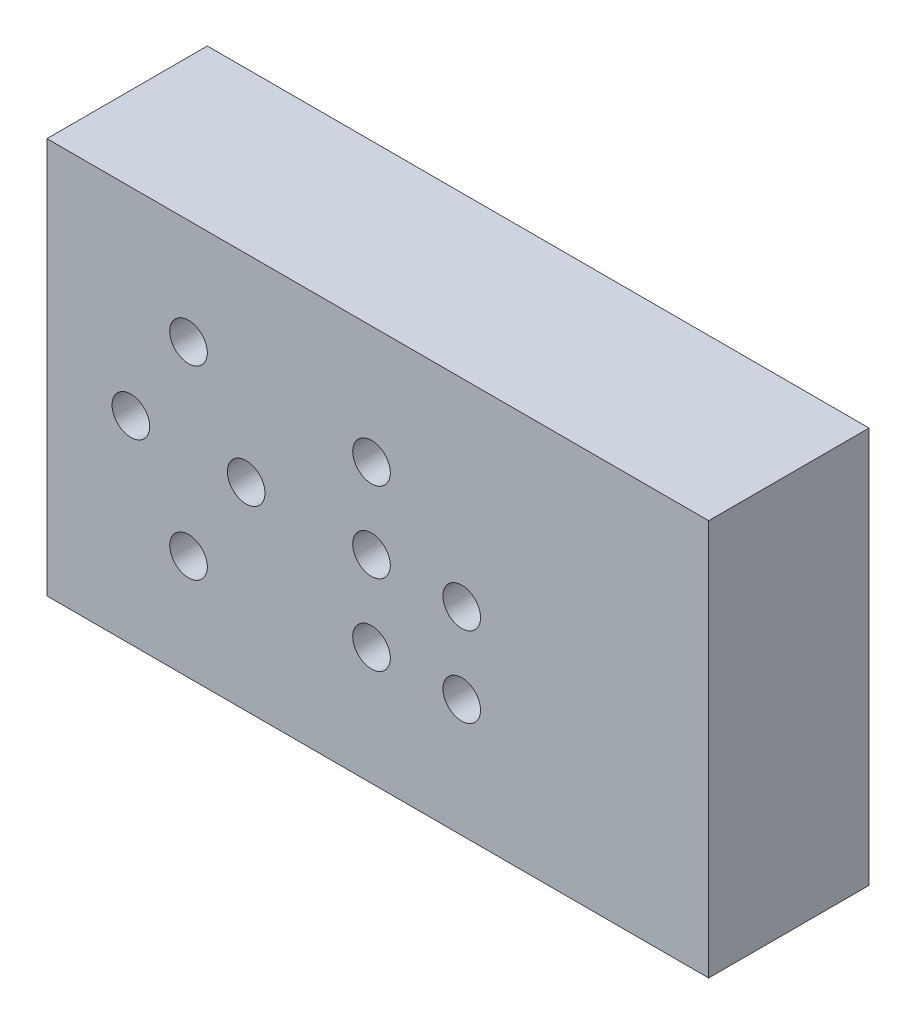
ISO-10303-21;
HEADER;
FILE_DESCRIPTION(('STEP AP214'),'2;1');
FILE_NAME('part.step','',(''),(''),'','','');
FILE_SCHEMA(('AUTOMOTIVE_DESIGN { 1 0 10303 214 1 1 1 1 }'));
ENDSEC;
DATA;
#1=APPLICATION_CONTEXT('core data for automotive mechanical design processes');
#2=APPLICATION_PROTOCOL_DEFINITION('international standard','automotive_design',2000,#1);
#3=PRODUCT_CONTEXT('',#1,'mechanical');
#4=PRODUCT('Part','Part','',(#3));
#5=PRODUCT_RELATED_PRODUCT_CATEGORY('part','',(#4));
#6=PRODUCT_DEFINITION_FORMATION('','',#4);
#7=PRODUCT_DEFINITION_CONTEXT('part definition',#1,'design');
#8=PRODUCT_DEFINITION('design','',#6,#7);
#9=PRODUCT_DEFINITION_SHAPE('','',#8);
#10=(LENGTH_UNIT() NAMED_UNIT(*) SI_UNIT(.MILLI.,.METRE.));
#11=(NAMED_UNIT(*) PLANE_ANGLE_UNIT() SI_UNIT($,.RADIAN.));
#12=(NAMED_UNIT(*) SI_UNIT($,.STERADIAN.) SOLID_ANGLE_UNIT());
#13=UNCERTAINTY_MEASURE_WITH_UNIT(LENGTH_MEASURE(1.E-05),#10,'distance_accuracy_value','');
#14=(GEOMETRIC_REPRESENTATION_CONTEXT(3) GLOBAL_UNCERTAINTY_ASSIGNED_CONTEXT((#13)) GLOBAL_UNIT_ASSIGNED_CONTEXT((#10,
#11,#12)) REPRESENTATION_CONTEXT('',''));
#15=CARTESIAN_POINT('',(0.,0.,0.));
#16=DIRECTION('',(0.,0.,1.));
#17=DIRECTION('',(1.,0.,0.));
#18=AXIS2_PLACEMENT_3D('',#15,#16,#17);
#19=CARTESIAN_POINT('',(0.,0.,32.));
#20=DIRECTION('',(0.,0.,-1.));
#21=DIRECTION('',(-1.,0.,0.));
#22=AXIS2_PLACEMENT_3D('',#19,#20,#21);
#23=PLANE('',#22);
#24=CARTESIAN_POINT('',(-45.,-18.5,32.));
#25=DIRECTION('',(0.,0.,-1.));
#26=DIRECTION('',(-1.,0.,0.));
#27=AXIS2_PLACEMENT_3D('',#24,#25,#26);
#28=CIRCLE('',#27,3.75);
#29=CARTESIAN_POINT('',(-48.75,-18.5,32.));
#30=VERTEX_POINT('',#29);
#31=EDGE_CURVE('E178',#30,#30,#28,.T.);
#32=ORIENTED_EDGE('',*,*,#31,.T.);
#33=EDGE_LOOP('',(#32));
#34=FACE_BOUND('',#33,.T.);
#35=CARTESIAN_POINT('',(-33.5,0.,32.));
#36=DIRECTION('',(0.,0.,-1.));
#37=DIRECTION('',(-1.,0.,0.));
#38=AXIS2_PLACEMENT_3D('',#35,#36,#37);
#39=CIRCLE('',#38,3.75000000000001);
#40=CARTESIAN_POINT('',(-37.2500000000001,0.,32.));
#41=VERTEX_POINT('',#40);
#42=EDGE_CURVE('E175',#41,#41,#39,.F.);
#43=ORIENTED_EDGE('',*,*,#42,.F.);
#44=EDGE_LOOP('',(#43));
#45=FACE_BOUND('',#44,.T.);
#46=CARTESIAN_POINT('',(-56.5,0.,32.));
#47=DIRECTION('',(0.,0.,-1.));
#48=DIRECTION('',(-1.,0.,0.));
#49=AXIS2_PLACEMENT_3D('',#46,#47,#48);
#50=CIRCLE('',#49,3.75000000000001);
#51=CARTESIAN_POINT('',(-60.25,0.,32.));
#52=VERTEX_POINT('',#51);
#53=EDGE_CURVE('E172',#52,#52,#50,.F.);
#54=ORIENTED_EDGE('',*,*,#53,.F.);
#55=EDGE_LOOP('',(#54));
#56=FACE_BOUND('',#55,.T.);
#57=CARTESIAN_POINT('',(-8.50000000000005,16.,32.));
#58=DIRECTION('',(0.,0.,-1.));
#59=DIRECTION('',(-1.,0.,0.));
#60=AXIS2_PLACEMENT_3D('',#57,#58,#59);
#61=CIRCLE('',#60,3.75000000000001);
#62=CARTESIAN_POINT('',(-12.2500000000001,16.,32.));
#63=VERTEX_POINT('',#62);
#64=EDGE_CURVE('E169',#63,#63,#61,.F.);
#65=ORIENTED_EDGE('',*,*,#64,.F.);
#66=EDGE_LOOP('',(#65));
#67=FACE_BOUND('',#66,.T.);
#68=CARTESIAN_POINT('',(-8.50000000000005,-16.,32.));
#69=DIRECTION('',(0.,0.,-1.));
#70=DIRECTION('',(-1.,0.,0.));
#71=AXIS2_PLACEMENT_3D('',#68,#69,#70);
#72=CIRCLE('',#71,3.75000000000001);
#73=CARTESIAN_POINT('',(-12.2500000000001,-16.,32.));
#74=VERTEX_POINT('',#73);
#75=EDGE_CURVE('E166',#74,#74,#72,.F.);
#76=ORIENTED_EDGE('',*,*,#75,.F.);
#77=EDGE_LOOP('',(#76));
#78=FACE_BOUND('',#77,.T.);
#79=DIRECTION('',(1.,0.,0.));
#80=VECTOR('',#79,1.);
#81=CARTESIAN_POINT('',(-73.2449194798456,39.5,32.));
#82=LINE('',#81,#80);
#83=CARTESIAN_POINT('',(-73.2449194798456,39.5,32.));
#84=VERTEX_POINT('',#83);
#85=CARTESIAN_POINT('',(58.7550805201544,39.5,32.));
#86=VERTEX_POINT('',#85);
#87=EDGE_CURVE('E97',#84,#86,#82,.T.);
#88=ORIENTED_EDGE('',*,*,#87,.F.);
#89=DIRECTION('',(0.,-1.,0.));
#90=VECTOR('',#89,1.);
#91=CARTESIAN_POINT('',(-73.2449194798456,39.5,32.));
#92=LINE('',#91,#90);
#93=CARTESIAN_POINT('',(-73.2449194798456,-39.5,32.));
#94=VERTEX_POINT('',#93);
#95=EDGE_CURVE('E94',#84,#94,#92,.T.);
#96=ORIENTED_EDGE('',*,*,#95,.T.);
#97=DIRECTION('',(-1.,0.,0.));
#98=VECTOR('',#97,1.);
#99=CARTESIAN_POINT('',(58.7550805201544,-39.5,32.));
#100=LINE('',#99,#98);
#101=CARTESIAN_POINT('',(58.7550805201544,-39.5,32.));
#102=VERTEX_POINT('',#101);
#103=EDGE_CURVE('E86',#102,#94,#100,.T.);
#104=ORIENTED_EDGE('',*,*,#103,.F.);
#105=DIRECTION('',(0.,-1.,0.));
#106=VECTOR('',#105,1.);
#107=CARTESIAN_POINT('',(58.7550805201544,39.5,32.));
#108=LINE('',#107,#106);
#109=EDGE_CURVE('E93',#86,#102,#108,.T.);
#110=ORIENTED_EDGE('',*,*,#109,.F.);
#111=EDGE_LOOP('',(#88,#96,#104,#110));
#112=FACE_BOUND('',#111,.T.);
#113=CARTESIAN_POINT('',(-45.,18.5,32.));
#114=DIRECTION('',(0.,0.,-1.));
#115=DIRECTION('',(-1.,0.,0.));
#116=AXIS2_PLACEMENT_3D('',#113,#114,#115);
#117=CIRCLE('',#116,3.75);
#118=CARTESIAN_POINT('',(-48.75,18.5,32.));
#119=VERTEX_POINT('',#118);
#120=EDGE_CURVE('E154',#119,#119,#117,.F.);
#121=ORIENTED_EDGE('',*,*,#120,.F.);
#122=EDGE_LOOP('',(#121));
#123=FACE_BOUND('',#122,.T.);
#124=CARTESIAN_POINT('',(9.49999999999991,-16.,32.));
#125=DIRECTION('',(0.,0.,-1.));
#126=DIRECTION('',(-1.,0.,0.));
#127=AXIS2_PLACEMENT_3D('',#124,#125,#126);
#128=CIRCLE('',#127,3.75000000000001);
#129=CARTESIAN_POINT('',(5.7499999999999,-16.,32.));
#130=VERTEX_POINT('',#129);
#131=EDGE_CURVE('E155',#130,#130,#128,.F.);
#132=ORIENTED_EDGE('',*,*,#131,.F.);
#133=EDGE_LOOP('',(#132));
#134=FACE_BOUND('',#133,.T.);
#135=CARTESIAN_POINT('',(9.49999999999991,0.,32.));
#136=DIRECTION('',(0.,0.,-1.));
#137=DIRECTION('',(-1.,0.,0.));
#138=AXIS2_PLACEMENT_3D('',#135,#136,#137);
#139=CIRCLE('',#138,3.75000000000001);
#140=CARTESIAN_POINT('',(5.7499999999999,0.,32.));
#141=VERTEX_POINT('',#140);
#142=EDGE_CURVE('E158',#141,#141,#139,.T.);
#143=ORIENTED_EDGE('',*,*,#142,.T.);
#144=EDGE_LOOP('',(#143));
#145=FACE_BOUND('',#144,.T.);
#146=CARTESIAN_POINT('',(-8.50000000000005,0.,32.));
#147=DIRECTION('',(0.,0.,-1.));
#148=DIRECTION('',(-1.,0.,0.));
#149=AXIS2_PLACEMENT_3D('',#146,#147,#148);
#150=CIRCLE('',#149,3.75000000000001);
#151=CARTESIAN_POINT('',(-12.2500000000001,0.,32.));
#152=VERTEX_POINT('',#151);
#153=EDGE_CURVE('E108',#152,#152,#150,.T.);
#154=ORIENTED_EDGE('',*,*,#153,.T.);
#155=EDGE_LOOP('',(#154));
#156=FACE_BOUND('',#155,.T.);
#157=ADVANCED_FACE('F37',(#34,#45,#56,#67,#78,#112,#123,#134,#145,#156),#23,.F.);
#158=CARTESIAN_POINT('',(0.,0.,0.));
#159=DIRECTION('',(0.,0.,-1.));
#160=DIRECTION('',(-1.,0.,0.));
#161=AXIS2_PLACEMENT_3D('',#158,#159,#160);
#162=PLANE('',#161);
#163=CARTESIAN_POINT('',(-33.5,0.,0.));
#164=DIRECTION('',(0.,0.,1.));
#165=DIRECTION('',(1.,0.,0.));
#166=AXIS2_PLACEMENT_3D('',#163,#164,#165);
#167=CIRCLE('',#166,3.75000000000001);
#168=CARTESIAN_POINT('',(-29.75,0.,0.));
#169=VERTEX_POINT('',#168);
#170=EDGE_CURVE('E207',#169,#169,#167,.T.);
#171=ORIENTED_EDGE('',*,*,#170,.T.);
#172=EDGE_LOOP('',(#171));
#173=FACE_BOUND('',#172,.T.);
#174=CARTESIAN_POINT('',(-56.5,0.,0.));
#175=DIRECTION('',(0.,0.,1.));
#176=DIRECTION('',(1.,0.,0.));
#177=AXIS2_PLACEMENT_3D('',#174,#175,#176);
#178=CIRCLE('',#177,3.75000000000001);
#179=CARTESIAN_POINT('',(-52.75,0.,0.));
#180=VERTEX_POINT('',#179);
#181=EDGE_CURVE('E160',#180,#180,#178,.T.);
#182=ORIENTED_EDGE('',*,*,#181,.T.);
#183=EDGE_LOOP('',(#182));
#184=FACE_BOUND('',#183,.T.);
#185=CARTESIAN_POINT('',(-8.50000000000005,16.,0.));
#186=DIRECTION('',(0.,0.,1.));
#187=DIRECTION('',(1.,0.,0.));
#188=AXIS2_PLACEMENT_3D('',#185,#186,#187);
#189=CIRCLE('',#188,3.75000000000001);
#190=CARTESIAN_POINT('',(-4.75000000000004,16.,0.));
#191=VERTEX_POINT('',#190);
#192=EDGE_CURVE('E232',#191,#191,#189,.T.);
#193=ORIENTED_EDGE('',*,*,#192,.T.);
#194=EDGE_LOOP('',(#193));
#195=FACE_BOUND('',#194,.T.);
#196=CARTESIAN_POINT('',(-8.50000000000005,-16.,0.));
#197=DIRECTION('',(0.,0.,1.));
#198=DIRECTION('',(1.,0.,0.));
#199=AXIS2_PLACEMENT_3D('',#196,#197,#198);
#200=CIRCLE('',#199,3.75000000000001);
#201=CARTESIAN_POINT('',(-4.75000000000004,-16.,0.));
#202=VERTEX_POINT('',#201);
#203=EDGE_CURVE('E230',#202,#202,#200,.T.);
#204=ORIENTED_EDGE('',*,*,#203,.T.);
#205=EDGE_LOOP('',(#204));
#206=FACE_BOUND('',#205,.T.);
#207=CARTESIAN_POINT('',(9.49999999999991,-16.,0.));
#208=DIRECTION('',(0.,0.,1.));
#209=DIRECTION('',(1.,0.,0.));
#210=AXIS2_PLACEMENT_3D('',#207,#208,#209);
#211=CIRCLE('',#210,3.75000000000001);
#212=CARTESIAN_POINT('',(13.2499999999999,-16.,0.));
#213=VERTEX_POINT('',#212);
#214=EDGE_CURVE('E239',#213,#213,#211,.T.);
#215=ORIENTED_EDGE('',*,*,#214,.T.);
#216=EDGE_LOOP('',(#215));
#217=FACE_BOUND('',#216,.T.);
#218=CARTESIAN_POINT('',(-45.,18.5,0.));
#219=DIRECTION('',(0.,0.,1.));
#220=DIRECTION('',(1.,0.,0.));
#221=AXIS2_PLACEMENT_3D('',#218,#219,#220);
#222=CIRCLE('',#221,3.75);
#223=CARTESIAN_POINT('',(-41.25,18.5,0.));
#224=VERTEX_POINT('',#223);
#225=EDGE_CURVE('E151',#224,#224,#222,.T.);
#226=ORIENTED_EDGE('',*,*,#225,.T.);
#227=EDGE_LOOP('',(#226));
#228=FACE_BOUND('',#227,.T.);
#229=DIRECTION('',(1.,0.,0.));
#230=VECTOR('',#229,1.);
#231=CARTESIAN_POINT('',(-73.2449194798456,39.5,0.));
#232=LINE('',#231,#230);
#233=CARTESIAN_POINT('',(-73.2449194798456,39.5,0.));
#234=VERTEX_POINT('',#233);
#235=CARTESIAN_POINT('',(58.7550805201544,39.5,0.));
#236=VERTEX_POINT('',#235);
#237=EDGE_CURVE('E104',#234,#236,#232,.T.);
#238=ORIENTED_EDGE('',*,*,#237,.T.);
#239=DIRECTION('',(0.,-1.,0.));
#240=VECTOR('',#239,1.);
#241=CARTESIAN_POINT('',(58.7550805201544,39.5,0.));
#242=LINE('',#241,#240);
#243=CARTESIAN_POINT('',(58.7550805201544,-39.5,0.));
#244=VERTEX_POINT('',#243);
#245=EDGE_CURVE('E107',#236,#244,#242,.T.);
#246=ORIENTED_EDGE('',*,*,#245,.T.);
#247=DIRECTION('',(-1.,0.,0.));
#248=VECTOR('',#247,1.);
#249=CARTESIAN_POINT('',(58.7550805201544,-39.5,0.));
#250=LINE('',#249,#248);
#251=CARTESIAN_POINT('',(-73.2449194798456,-39.5,0.));
#252=VERTEX_POINT('',#251);
#253=EDGE_CURVE('E88',#244,#252,#250,.T.);
#254=ORIENTED_EDGE('',*,*,#253,.T.);
#255=DIRECTION('',(0.,-1.,0.));
#256=VECTOR('',#255,1.);
#257=CARTESIAN_POINT('',(-73.2449194798456,39.5,0.));
#258=LINE('',#257,#256);
#259=EDGE_CURVE('E99',#234,#252,#258,.T.);
#260=ORIENTED_EDGE('',*,*,#259,.F.);
#261=EDGE_LOOP('',(#238,#246,#254,#260));
#262=FACE_BOUND('',#261,.T.);
#263=CARTESIAN_POINT('',(9.49999999999991,0.,0.));
#264=DIRECTION('',(0.,0.,-1.));
#265=DIRECTION('',(-1.,0.,0.));
#266=AXIS2_PLACEMENT_3D('',#263,#264,#265);
#267=CIRCLE('',#266,3.75000000000001);
#268=CARTESIAN_POINT('',(5.7499999999999,0.,0.));
#269=VERTEX_POINT('',#268);
#270=EDGE_CURVE('E233',#269,#269,#267,.T.);
#271=ORIENTED_EDGE('',*,*,#270,.F.);
#272=EDGE_LOOP('',(#271));
#273=FACE_BOUND('',#272,.T.);
#274=CARTESIAN_POINT('',(-45.,-18.5,0.));
#275=DIRECTION('',(0.,0.,-1.));
#276=DIRECTION('',(-1.,0.,0.));
#277=AXIS2_PLACEMENT_3D('',#274,#275,#276);
#278=CIRCLE('',#277,3.75);
#279=CARTESIAN_POINT('',(-48.75,-18.5,0.));
#280=VERTEX_POINT('',#279);
#281=EDGE_CURVE('E244',#280,#280,#278,.T.);
#282=ORIENTED_EDGE('',*,*,#281,.F.);
#283=EDGE_LOOP('',(#282));
#284=FACE_BOUND('',#283,.T.);
#285=CARTESIAN_POINT('',(-8.50000000000005,0.,0.));
#286=DIRECTION('',(0.,0.,-1.));
#287=DIRECTION('',(-1.,0.,0.));
#288=AXIS2_PLACEMENT_3D('',#285,#286,#287);
#289=CIRCLE('',#288,3.75000000000001);
#290=CARTESIAN_POINT('',(-12.2500000000001,0.,0.));
#291=VERTEX_POINT('',#290);
#292=EDGE_CURVE('E236',#291,#291,#289,.T.);
#293=ORIENTED_EDGE('',*,*,#292,.F.);
#294=EDGE_LOOP('',(#293));
#295=FACE_BOUND('',#294,.T.);
#296=ADVANCED_FACE('F114',(#173,#184,#195,#206,#217,#228,#262,#273,#284,#295),#162,.T.);
#297=CARTESIAN_POINT('',(-73.2449194798456,39.5,32.));
#298=DIRECTION('',(0.,1.,0.));
#299=DIRECTION('',(-1.,0.,0.));
#300=AXIS2_PLACEMENT_3D('',#297,#298,#299);
#301=PLANE('',#300);
#302=ORIENTED_EDGE('',*,*,#237,.F.);
#303=DIRECTION('',(0.,0.,-1.));
#304=VECTOR('',#303,1.);
#305=CARTESIAN_POINT('',(-73.2449194798456,39.5,32.));
#306=LINE('',#305,#304);
#307=EDGE_CURVE('E11',#84,#234,#306,.T.);
#308=ORIENTED_EDGE('',*,*,#307,.F.);
#309=ORIENTED_EDGE('',*,*,#87,.T.);
#310=DIRECTION('',(0.,0.,-1.));
#311=VECTOR('',#310,1.);
#312=CARTESIAN_POINT('',(58.7550805201544,39.5,32.));
#313=LINE('',#312,#311);
#314=EDGE_CURVE('E41',#86,#236,#313,.T.);
#315=ORIENTED_EDGE('',*,*,#314,.T.);
#316=EDGE_LOOP('',(#302,#308,#309,#315));
#317=FACE_BOUND('',#316,.T.);
#318=ADVANCED_FACE('F39',(#317),#301,.T.);
#319=CARTESIAN_POINT('',(-73.2449194798456,39.5,32.));
#320=DIRECTION('',(1.,0.,0.));
#321=DIRECTION('',(0.,0.,-1.));
#322=AXIS2_PLACEMENT_3D('',#319,#320,#321);
#323=PLANE('',#322);
#324=ORIENTED_EDGE('',*,*,#259,.T.);
#325=DIRECTION('',(0.,0.,-1.));
#326=VECTOR('',#325,1.);
#327=CARTESIAN_POINT('',(-73.2449194798456,-39.5,32.));
#328=LINE('',#327,#326);
#329=EDGE_CURVE('E47',#94,#252,#328,.T.);
#330=ORIENTED_EDGE('',*,*,#329,.F.);
#331=ORIENTED_EDGE('',*,*,#95,.F.);
#332=ORIENTED_EDGE('',*,*,#307,.T.);
#333=EDGE_LOOP('',(#324,#330,#331,#332));
#334=FACE_BOUND('',#333,.T.);
#335=ADVANCED_FACE('F112',(#334),#323,.F.);
#336=CARTESIAN_POINT('',(58.7550805201544,-39.5,32.));
#337=DIRECTION('',(0.,-1.,0.));
#338=DIRECTION('',(1.,0.,0.));
#339=AXIS2_PLACEMENT_3D('',#336,#337,#338);
#340=PLANE('',#339);
#341=ORIENTED_EDGE('',*,*,#253,.F.);
#342=DIRECTION('',(0.,0.,-1.));
#343=VECTOR('',#342,1.);
#344=CARTESIAN_POINT('',(58.7550805201544,-39.5,32.));
#345=LINE('',#344,#343);
#346=EDGE_CURVE('E83',#102,#244,#345,.T.);
#347=ORIENTED_EDGE('',*,*,#346,.F.);
#348=ORIENTED_EDGE('',*,*,#103,.T.);
#349=ORIENTED_EDGE('',*,*,#329,.T.);
#350=EDGE_LOOP('',(#341,#347,#348,#349));
#351=FACE_BOUND('',#350,.T.);
#352=ADVANCED_FACE('F85',(#351),#340,.T.);
#353=CARTESIAN_POINT('',(58.7550805201544,39.5,32.));
#354=DIRECTION('',(1.,0.,0.));
#355=DIRECTION('',(0.,0.,-1.));
#356=AXIS2_PLACEMENT_3D('',#353,#354,#355);
#357=PLANE('',#356);
#358=ORIENTED_EDGE('',*,*,#245,.F.);
#359=ORIENTED_EDGE('',*,*,#314,.F.);
#360=ORIENTED_EDGE('',*,*,#109,.T.);
#361=ORIENTED_EDGE('',*,*,#346,.T.);
#362=EDGE_LOOP('',(#358,#359,#360,#361));
#363=FACE_BOUND('',#362,.T.);
#364=ADVANCED_FACE('F96',(#363),#357,.T.);
#365=CARTESIAN_POINT('',(-45.,18.5,42.));
#366=DIRECTION('',(0.,0.,-1.));
#367=DIRECTION('',(-1.,0.,0.));
#368=AXIS2_PLACEMENT_3D('',#365,#366,#367);
#369=CYLINDRICAL_SURFACE('',#368,3.75);
#370=ORIENTED_EDGE('',*,*,#225,.F.);
#371=EDGE_LOOP('',(#370));
#372=FACE_BOUND('',#371,.T.);
#373=ORIENTED_EDGE('',*,*,#120,.T.);
#374=EDGE_LOOP('',(#373));
#375=FACE_BOUND('',#374,.T.);
#376=ADVANCED_FACE('F132',(#372,#375),#369,.F.);
#377=CARTESIAN_POINT('',(9.49999999999991,-16.,42.));
#378=DIRECTION('',(0.,0.,-1.));
#379=DIRECTION('',(-1.,0.,0.));
#380=AXIS2_PLACEMENT_3D('',#377,#378,#379);
#381=CYLINDRICAL_SURFACE('',#380,3.75000000000001);
#382=ORIENTED_EDGE('',*,*,#214,.F.);
#383=EDGE_LOOP('',(#382));
#384=FACE_BOUND('',#383,.T.);
#385=ORIENTED_EDGE('',*,*,#131,.T.);
#386=EDGE_LOOP('',(#385));
#387=FACE_BOUND('',#386,.T.);
#388=ADVANCED_FACE('F140',(#384,#387),#381,.F.);
#389=CARTESIAN_POINT('',(9.49999999999991,0.,42.));
#390=DIRECTION('',(0.,0.,-1.));
#391=DIRECTION('',(-1.,0.,0.));
#392=AXIS2_PLACEMENT_3D('',#389,#390,#391);
#393=CYLINDRICAL_SURFACE('',#392,3.75000000000001);
#394=ORIENTED_EDGE('',*,*,#270,.T.);
#395=EDGE_LOOP('',(#394));
#396=FACE_BOUND('',#395,.T.);
#397=ORIENTED_EDGE('',*,*,#142,.F.);
#398=EDGE_LOOP('',(#397));
#399=FACE_BOUND('',#398,.T.);
#400=ADVANCED_FACE('F145',(#396,#399),#393,.F.);
#401=CARTESIAN_POINT('',(-8.50000000000005,-16.,42.));
#402=DIRECTION('',(0.,0.,-1.));
#403=DIRECTION('',(-1.,0.,0.));
#404=AXIS2_PLACEMENT_3D('',#401,#402,#403);
#405=CYLINDRICAL_SURFACE('',#404,3.75000000000001);
#406=ORIENTED_EDGE('',*,*,#203,.F.);
#407=EDGE_LOOP('',(#406));
#408=FACE_BOUND('',#407,.T.);
#409=ORIENTED_EDGE('',*,*,#75,.T.);
#410=EDGE_LOOP('',(#409));
#411=FACE_BOUND('',#410,.T.);
#412=ADVANCED_FACE('F216',(#408,#411),#405,.F.);
#413=CARTESIAN_POINT('',(-8.50000000000005,16.,42.));
#414=DIRECTION('',(0.,0.,-1.));
#415=DIRECTION('',(-1.,0.,0.));
#416=AXIS2_PLACEMENT_3D('',#413,#414,#415);
#417=CYLINDRICAL_SURFACE('',#416,3.75000000000001);
#418=ORIENTED_EDGE('',*,*,#192,.F.);
#419=EDGE_LOOP('',(#418));
#420=FACE_BOUND('',#419,.T.);
#421=ORIENTED_EDGE('',*,*,#64,.T.);
#422=EDGE_LOOP('',(#421));
#423=FACE_BOUND('',#422,.T.);
#424=ADVANCED_FACE('F198',(#420,#423),#417,.F.);
#425=CARTESIAN_POINT('',(-56.5,0.,42.));
#426=DIRECTION('',(0.,0.,-1.));
#427=DIRECTION('',(-1.,0.,0.));
#428=AXIS2_PLACEMENT_3D('',#425,#426,#427);
#429=CYLINDRICAL_SURFACE('',#428,3.75000000000001);
#430=ORIENTED_EDGE('',*,*,#181,.F.);
#431=EDGE_LOOP('',(#430));
#432=FACE_BOUND('',#431,.T.);
#433=ORIENTED_EDGE('',*,*,#53,.T.);
#434=EDGE_LOOP('',(#433));
#435=FACE_BOUND('',#434,.T.);
#436=ADVANCED_FACE('F196',(#432,#435),#429,.F.);
#437=CARTESIAN_POINT('',(-33.5,0.,42.));
#438=DIRECTION('',(0.,0.,-1.));
#439=DIRECTION('',(-1.,0.,0.));
#440=AXIS2_PLACEMENT_3D('',#437,#438,#439);
#441=CYLINDRICAL_SURFACE('',#440,3.75000000000001);
#442=ORIENTED_EDGE('',*,*,#170,.F.);
#443=EDGE_LOOP('',(#442));
#444=FACE_BOUND('',#443,.T.);
#445=ORIENTED_EDGE('',*,*,#42,.T.);
#446=EDGE_LOOP('',(#445));
#447=FACE_BOUND('',#446,.T.);
#448=ADVANCED_FACE('F191',(#444,#447),#441,.F.);
#449=CARTESIAN_POINT('',(-45.,-18.5,42.));
#450=DIRECTION('',(0.,0.,-1.));
#451=DIRECTION('',(-1.,0.,0.));
#452=AXIS2_PLACEMENT_3D('',#449,#450,#451);
#453=CYLINDRICAL_SURFACE('',#452,3.75);
#454=ORIENTED_EDGE('',*,*,#281,.T.);
#455=EDGE_LOOP('',(#454));
#456=FACE_BOUND('',#455,.T.);
#457=ORIENTED_EDGE('',*,*,#31,.F.);
#458=EDGE_LOOP('',(#457));
#459=FACE_BOUND('',#458,.T.);
#460=ADVANCED_FACE('F185',(#456,#459),#453,.F.);
#461=CARTESIAN_POINT('',(-8.50000000000005,0.,42.));
#462=DIRECTION('',(0.,0.,-1.));
#463=DIRECTION('',(-1.,0.,0.));
#464=AXIS2_PLACEMENT_3D('',#461,#462,#463);
#465=CYLINDRICAL_SURFACE('',#464,3.75000000000001);
#466=ORIENTED_EDGE('',*,*,#292,.T.);
#467=EDGE_LOOP('',(#466));
#468=FACE_BOUND('',#467,.T.);
#469=ORIENTED_EDGE('',*,*,#153,.F.);
#470=EDGE_LOOP('',(#469));
#471=FACE_BOUND('',#470,.T.);
#472=ADVANCED_FACE('F183',(#468,#471),#465,.F.);
#473=CLOSED_SHELL('',(#157,#296,#318,#335,#352,#364,#376,#388,#400,#412,#424,#436,#448,#460,#472));
#474=MANIFOLD_SOLID_BREP('B2',#473);
#475=ADVANCED_BREP_SHAPE_REPRESENTATION('',(#18,#474),#14);
#476=SHAPE_DEFINITION_REPRESENTATION(#9,#475);
ENDSEC;
END-ISO-10303-21;
